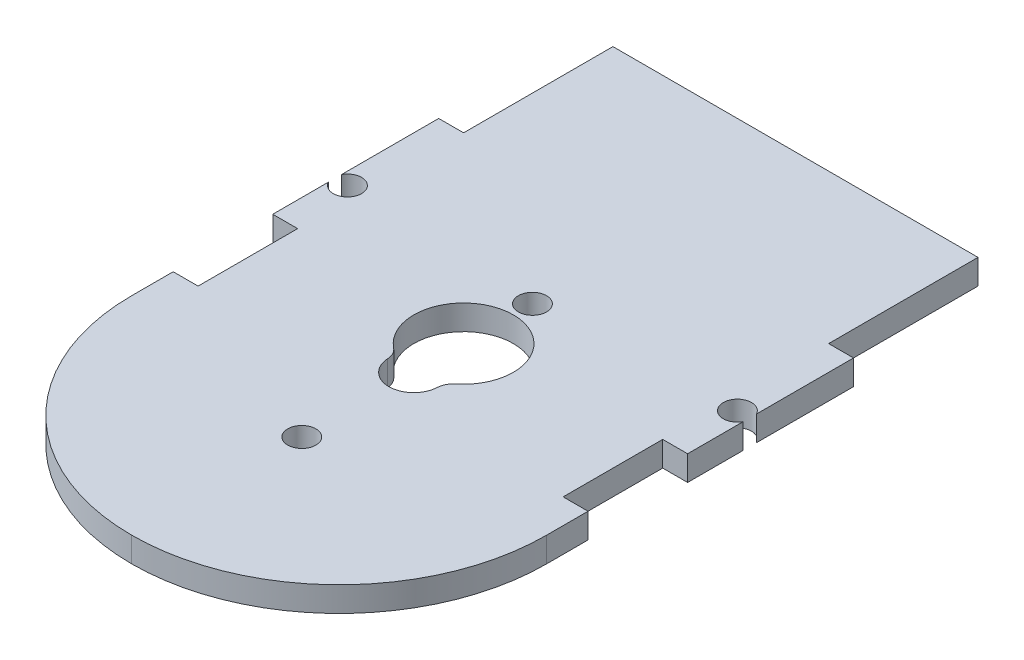
ISO-10303-21;
HEADER;
FILE_DESCRIPTION(('STEP AP214'),'2;1');
FILE_NAME('part.step','',(''),(''),'','','');
FILE_SCHEMA(('AUTOMOTIVE_DESIGN { 1 0 10303 214 1 1 1 1 }'));
ENDSEC;
DATA;
#1=APPLICATION_CONTEXT('core data for automotive mechanical design processes');
#2=APPLICATION_PROTOCOL_DEFINITION('international standard','automotive_design',2000,#1);
#3=PRODUCT_CONTEXT('',#1,'mechanical');
#4=PRODUCT('Part','Part','',(#3));
#5=PRODUCT_RELATED_PRODUCT_CATEGORY('part','',(#4));
#6=PRODUCT_DEFINITION_FORMATION('','',#4);
#7=PRODUCT_DEFINITION_CONTEXT('part definition',#1,'design');
#8=PRODUCT_DEFINITION('design','',#6,#7);
#9=PRODUCT_DEFINITION_SHAPE('','',#8);
#10=(LENGTH_UNIT() NAMED_UNIT(*) SI_UNIT(.MILLI.,.METRE.));
#11=(NAMED_UNIT(*) PLANE_ANGLE_UNIT() SI_UNIT($,.RADIAN.));
#12=(NAMED_UNIT(*) SI_UNIT($,.STERADIAN.) SOLID_ANGLE_UNIT());
#13=UNCERTAINTY_MEASURE_WITH_UNIT(LENGTH_MEASURE(1.E-05),#10,'distance_accuracy_value','');
#14=(GEOMETRIC_REPRESENTATION_CONTEXT(3) GLOBAL_UNCERTAINTY_ASSIGNED_CONTEXT((#13)) GLOBAL_UNIT_ASSIGNED_CONTEXT((#10,
#11,#12)) REPRESENTATION_CONTEXT('',''));
#15=CARTESIAN_POINT('',(0.,0.,0.));
#16=DIRECTION('',(0.,0.,1.));
#17=DIRECTION('',(1.,0.,0.));
#18=AXIS2_PLACEMENT_3D('',#15,#16,#17);
#19=CARTESIAN_POINT('',(0.,3.,0.));
#20=DIRECTION('',(1.,0.,0.));
#21=DIRECTION('',(0.,0.,-1.));
#22=AXIS2_PLACEMENT_3D('',#19,#20,#21);
#23=PLANE('',#22);
#24=DIRECTION('',(0.,0.,1.));
#25=VECTOR('',#24,1.);
#26=CARTESIAN_POINT('',(0.,0.,0.));
#27=LINE('',#26,#25);
#28=CARTESIAN_POINT('',(0.,0.,-62.));
#29=VERTEX_POINT('',#28);
#30=CARTESIAN_POINT('',(0.,0.,-50.3));
#31=VERTEX_POINT('',#30);
#32=EDGE_CURVE('E213',#29,#31,#27,.T.);
#33=ORIENTED_EDGE('',*,*,#32,.T.);
#34=DIRECTION('',(0.,1.,0.));
#35=VECTOR('',#34,1.);
#36=CARTESIAN_POINT('',(0.,3.,-50.3));
#37=LINE('',#36,#35);
#38=CARTESIAN_POINT('',(0.,3.,-50.3));
#39=VERTEX_POINT('',#38);
#40=EDGE_CURVE('E197',#31,#39,#37,.T.);
#41=ORIENTED_EDGE('',*,*,#40,.T.);
#42=DIRECTION('',(0.,0.,1.));
#43=VECTOR('',#42,1.);
#44=CARTESIAN_POINT('',(0.,3.,0.));
#45=LINE('',#44,#43);
#46=CARTESIAN_POINT('',(0.,3.,-62.));
#47=VERTEX_POINT('',#46);
#48=EDGE_CURVE('E248',#47,#39,#45,.T.);
#49=ORIENTED_EDGE('',*,*,#48,.F.);
#50=DIRECTION('',(0.,1.,0.));
#51=VECTOR('',#50,1.);
#52=CARTESIAN_POINT('',(0.,0.,-62.));
#53=LINE('',#52,#51);
#54=EDGE_CURVE('E218',#29,#47,#53,.T.);
#55=ORIENTED_EDGE('',*,*,#54,.F.);
#56=EDGE_LOOP('',(#33,#41,#49,#55));
#57=FACE_BOUND('',#56,.T.);
#58=ADVANCED_FACE('F33',(#57),#23,.F.);
#59=CARTESIAN_POINT('',(50.,3.,0.));
#60=DIRECTION('',(-1.,0.,0.));
#61=DIRECTION('',(0.,0.,1.));
#62=AXIS2_PLACEMENT_3D('',#59,#60,#61);
#63=PLANE('',#62);
#64=DIRECTION('',(0.,0.,-1.));
#65=VECTOR('',#64,1.);
#66=CARTESIAN_POINT('',(50.,0.,0.));
#67=LINE('',#66,#65);
#68=CARTESIAN_POINT('',(50.,0.,-42.));
#69=VERTEX_POINT('',#68);
#70=CARTESIAN_POINT('',(50.,0.,-48.7));
#71=VERTEX_POINT('',#70);
#72=EDGE_CURVE('E222',#69,#71,#67,.T.);
#73=ORIENTED_EDGE('',*,*,#72,.T.);
#74=DIRECTION('',(0.,1.,0.));
#75=VECTOR('',#74,1.);
#76=CARTESIAN_POINT('',(50.,3.,-48.7));
#77=LINE('',#76,#75);
#78=CARTESIAN_POINT('',(50.,3.,-48.7));
#79=VERTEX_POINT('',#78);
#80=EDGE_CURVE('E55',#71,#79,#77,.T.);
#81=ORIENTED_EDGE('',*,*,#80,.T.);
#82=DIRECTION('',(0.,0.,-1.));
#83=VECTOR('',#82,1.);
#84=CARTESIAN_POINT('',(50.,3.,0.));
#85=LINE('',#84,#83);
#86=CARTESIAN_POINT('',(50.,3.,-42.));
#87=VERTEX_POINT('',#86);
#88=EDGE_CURVE('E252',#87,#79,#85,.T.);
#89=ORIENTED_EDGE('',*,*,#88,.F.);
#90=DIRECTION('',(0.,1.,0.));
#91=VECTOR('',#90,1.);
#92=CARTESIAN_POINT('',(50.,0.,-42.));
#93=LINE('',#92,#91);
#94=EDGE_CURVE('E398',#69,#87,#93,.T.);
#95=ORIENTED_EDGE('',*,*,#94,.F.);
#96=EDGE_LOOP('',(#73,#81,#89,#95));
#97=FACE_BOUND('',#96,.T.);
#98=ADVANCED_FACE('F341',(#97),#63,.F.);
#99=CARTESIAN_POINT('',(0.,0.,0.));
#100=DIRECTION('',(0.,-1.,0.));
#101=DIRECTION('',(0.,0.,-1.));
#102=AXIS2_PLACEMENT_3D('',#99,#100,#101);
#103=PLANE('',#102);
#104=CARTESIAN_POINT('',(1.5,0.,-49.5));
#105=DIRECTION('',(0.,1.,0.));
#106=DIRECTION('',(0.,0.,1.));
#107=AXIS2_PLACEMENT_3D('',#104,#105,#106);
#108=CIRCLE('',#107,1.7);
#109=CARTESIAN_POINT('',(0.,0.,-48.7));
#110=VERTEX_POINT('',#109);
#111=EDGE_CURVE('E200',#110,#31,#108,.T.);
#112=ORIENTED_EDGE('',*,*,#111,.T.);
#113=ORIENTED_EDGE('',*,*,#32,.F.);
#114=DIRECTION('',(1.,0.,0.));
#115=VECTOR('',#114,1.);
#116=CARTESIAN_POINT('',(0.,0.,-62.));
#117=LINE('',#116,#115);
#118=CARTESIAN_POINT('',(3.,0.,-62.));
#119=VERTEX_POINT('',#118);
#120=EDGE_CURVE('E469',#29,#119,#117,.T.);
#121=ORIENTED_EDGE('',*,*,#120,.T.);
#122=DIRECTION('',(0.,0.,-1.));
#123=VECTOR('',#122,1.);
#124=CARTESIAN_POINT('',(3.,0.,-80.));
#125=LINE('',#124,#123);
#126=CARTESIAN_POINT('',(3.,0.,-80.));
#127=VERTEX_POINT('',#126);
#128=EDGE_CURVE('E421',#119,#127,#125,.T.);
#129=ORIENTED_EDGE('',*,*,#128,.T.);
#130=DIRECTION('',(-1.,0.,0.));
#131=VECTOR('',#130,1.);
#132=CARTESIAN_POINT('',(0.,0.,-80.));
#133=LINE('',#132,#131);
#134=CARTESIAN_POINT('',(47.,0.,-80.));
#135=VERTEX_POINT('',#134);
#136=EDGE_CURVE('E247',#135,#127,#133,.T.);
#137=ORIENTED_EDGE('',*,*,#136,.F.);
#138=DIRECTION('',(0.,0.,1.));
#139=VECTOR('',#138,1.);
#140=CARTESIAN_POINT('',(47.,0.,-80.));
#141=LINE('',#140,#139);
#142=CARTESIAN_POINT('',(47.,0.,-62.));
#143=VERTEX_POINT('',#142);
#144=EDGE_CURVE('E401',#135,#143,#141,.T.);
#145=ORIENTED_EDGE('',*,*,#144,.T.);
#146=DIRECTION('',(1.,0.,0.));
#147=VECTOR('',#146,1.);
#148=CARTESIAN_POINT('',(50.,0.,-62.));
#149=LINE('',#148,#147);
#150=CARTESIAN_POINT('',(50.,0.,-62.));
#151=VERTEX_POINT('',#150);
#152=EDGE_CURVE('E312',#143,#151,#149,.T.);
#153=ORIENTED_EDGE('',*,*,#152,.T.);
#154=CARTESIAN_POINT('',(50.,0.,-50.3));
#155=VERTEX_POINT('',#154);
#156=EDGE_CURVE('E219',#155,#151,#67,.T.);
#157=ORIENTED_EDGE('',*,*,#156,.F.);
#158=CARTESIAN_POINT('',(48.5,0.,-49.5));
#159=DIRECTION('',(0.,1.,0.));
#160=DIRECTION('',(0.,0.,1.));
#161=AXIS2_PLACEMENT_3D('',#158,#159,#160);
#162=CIRCLE('',#161,1.7);
#163=EDGE_CURVE('E41',#155,#71,#162,.T.);
#164=ORIENTED_EDGE('',*,*,#163,.T.);
#165=ORIENTED_EDGE('',*,*,#72,.F.);
#166=DIRECTION('',(-1.,0.,0.));
#167=VECTOR('',#166,1.);
#168=CARTESIAN_POINT('',(50.,0.,-42.));
#169=LINE('',#168,#167);
#170=CARTESIAN_POINT('',(47.,0.,-42.));
#171=VERTEX_POINT('',#170);
#172=EDGE_CURVE('E422',#69,#171,#169,.T.);
#173=ORIENTED_EDGE('',*,*,#172,.T.);
#174=DIRECTION('',(0.,0.,1.));
#175=VECTOR('',#174,1.);
#176=CARTESIAN_POINT('',(47.,0.,-42.));
#177=LINE('',#176,#175);
#178=CARTESIAN_POINT('',(47.,0.,-30.));
#179=VERTEX_POINT('',#178);
#180=EDGE_CURVE('E425',#171,#179,#177,.T.);
#181=ORIENTED_EDGE('',*,*,#180,.T.);
#182=DIRECTION('',(1.,0.,0.));
#183=VECTOR('',#182,1.);
#184=CARTESIAN_POINT('',(50.,0.,-30.));
#185=LINE('',#184,#183);
#186=CARTESIAN_POINT('',(50.,0.,-30.));
#187=VERTEX_POINT('',#186);
#188=EDGE_CURVE('E400',#179,#187,#185,.T.);
#189=ORIENTED_EDGE('',*,*,#188,.T.);
#190=CARTESIAN_POINT('',(50.,0.,-25.));
#191=VERTEX_POINT('',#190);
#192=EDGE_CURVE('E224',#191,#187,#67,.T.);
#193=ORIENTED_EDGE('',*,*,#192,.F.);
#194=CARTESIAN_POINT('',(25.,0.,-25.));
#195=DIRECTION('',(0.,-1.,0.));
#196=DIRECTION('',(0.,0.,-1.));
#197=AXIS2_PLACEMENT_3D('',#194,#195,#196);
#198=CIRCLE('',#197,25.);
#199=CARTESIAN_POINT('',(25.,0.,0.));
#200=VERTEX_POINT('',#199);
#201=EDGE_CURVE('E281',#191,#200,#198,.T.);
#202=ORIENTED_EDGE('',*,*,#201,.T.);
#203=CARTESIAN_POINT('',(25.,0.,-25.));
#204=DIRECTION('',(0.,-1.,0.));
#205=DIRECTION('',(0.,0.,-1.));
#206=AXIS2_PLACEMENT_3D('',#203,#204,#205);
#207=CIRCLE('',#206,25.);
#208=CARTESIAN_POINT('',(0.,0.,-25.));
#209=VERTEX_POINT('',#208);
#210=EDGE_CURVE('E283',#200,#209,#207,.T.);
#211=ORIENTED_EDGE('',*,*,#210,.T.);
#212=CARTESIAN_POINT('',(0.,0.,-30.));
#213=VERTEX_POINT('',#212);
#214=EDGE_CURVE('E221',#213,#209,#27,.T.);
#215=ORIENTED_EDGE('',*,*,#214,.F.);
#216=DIRECTION('',(1.,0.,0.));
#217=VECTOR('',#216,1.);
#218=CARTESIAN_POINT('',(0.,0.,-30.));
#219=LINE('',#218,#217);
#220=CARTESIAN_POINT('',(3.,0.,-30.));
#221=VERTEX_POINT('',#220);
#222=EDGE_CURVE('E458',#213,#221,#219,.T.);
#223=ORIENTED_EDGE('',*,*,#222,.T.);
#224=DIRECTION('',(0.,0.,-1.));
#225=VECTOR('',#224,1.);
#226=CARTESIAN_POINT('',(3.,0.,-42.));
#227=LINE('',#226,#225);
#228=CARTESIAN_POINT('',(3.,0.,-42.));
#229=VERTEX_POINT('',#228);
#230=EDGE_CURVE('E497',#221,#229,#227,.T.);
#231=ORIENTED_EDGE('',*,*,#230,.T.);
#232=DIRECTION('',(-1.,0.,0.));
#233=VECTOR('',#232,1.);
#234=CARTESIAN_POINT('',(0.,0.,-42.));
#235=LINE('',#234,#233);
#236=CARTESIAN_POINT('',(0.,0.,-42.));
#237=VERTEX_POINT('',#236);
#238=EDGE_CURVE('E468',#229,#237,#235,.T.);
#239=ORIENTED_EDGE('',*,*,#238,.T.);
#240=EDGE_CURVE('E215',#110,#237,#27,.T.);
#241=ORIENTED_EDGE('',*,*,#240,.F.);
#242=EDGE_LOOP('',(#112,#113,#121,#129,#137,#145,#153,#157,#164,#165,#173,#181,#189,#193,#202,
#211,#215,#223,#231,#239,#241));
#243=FACE_BOUND('',#242,.T.);
#244=CARTESIAN_POINT('',(25.,0.,-48.3));
#245=DIRECTION('',(0.,1.,0.));
#246=DIRECTION('',(0.,0.,1.));
#247=AXIS2_PLACEMENT_3D('',#244,#245,#246);
#248=CIRCLE('',#247,1.7);
#249=CARTESIAN_POINT('',(25.,0.,-46.6));
#250=VERTEX_POINT('',#249);
#251=EDGE_CURVE('E487',#250,#250,#248,.T.);
#252=ORIENTED_EDGE('',*,*,#251,.T.);
#253=EDGE_LOOP('',(#252));
#254=FACE_BOUND('',#253,.T.);
#255=CARTESIAN_POINT('',(25.,0.,-20.5));
#256=DIRECTION('',(0.,1.,0.));
#257=DIRECTION('',(0.,0.,1.));
#258=AXIS2_PLACEMENT_3D('',#255,#256,#257);
#259=CIRCLE('',#258,1.7);
#260=CARTESIAN_POINT('',(25.,0.,-18.8));
#261=VERTEX_POINT('',#260);
#262=EDGE_CURVE('E493',#261,#261,#259,.T.);
#263=ORIENTED_EDGE('',*,*,#262,.T.);
#264=EDGE_LOOP('',(#263));
#265=FACE_BOUND('',#264,.T.);
#266=CARTESIAN_POINT('',(25.,0.,-34.));
#267=DIRECTION('',(0.,1.,0.));
#268=DIRECTION('',(0.,0.,1.));
#269=AXIS2_PLACEMENT_3D('',#266,#267,#268);
#270=CIRCLE('',#269,3.);
#271=CARTESIAN_POINT('',(22.0037523466843,0.,-33.85));
#272=VERTEX_POINT('',#271);
#273=CARTESIAN_POINT('',(27.9962476533157,0.,-33.85));
#274=VERTEX_POINT('',#273);
#275=EDGE_CURVE('E238',#272,#274,#270,.T.);
#276=ORIENTED_EDGE('',*,*,#275,.T.);
#277=CARTESIAN_POINT('',(29.9937460888596,0.,-33.75));
#278=DIRECTION('',(0.,-1.,0.));
#279=DIRECTION('',(0.,0.,-1.));
#280=AXIS2_PLACEMENT_3D('',#277,#278,#279);
#281=CIRCLE('',#280,2.);
#282=CARTESIAN_POINT('',(28.7453095666447,0.,-35.3125));
#283=VERTEX_POINT('',#282);
#284=EDGE_CURVE('E279',#274,#283,#281,.T.);
#285=ORIENTED_EDGE('',*,*,#284,.T.);
#286=CARTESIAN_POINT('',(25.,0.,-40.));
#287=DIRECTION('',(0.,1.,0.));
#288=DIRECTION('',(0.,0.,1.));
#289=AXIS2_PLACEMENT_3D('',#286,#287,#288);
#290=CIRCLE('',#289,6.00000000000001);
#291=CARTESIAN_POINT('',(21.2546904333553,0.,-35.3125));
#292=VERTEX_POINT('',#291);
#293=EDGE_CURVE('E226',#283,#292,#290,.T.);
#294=ORIENTED_EDGE('',*,*,#293,.T.);
#295=CARTESIAN_POINT('',(20.0062539111405,0.,-33.75));
#296=DIRECTION('',(0.,-1.,0.));
#297=DIRECTION('',(0.,0.,-1.));
#298=AXIS2_PLACEMENT_3D('',#295,#296,#297);
#299=CIRCLE('',#298,2.);
#300=EDGE_CURVE('E277',#292,#272,#299,.T.);
#301=ORIENTED_EDGE('',*,*,#300,.T.);
#302=EDGE_LOOP('',(#276,#285,#294,#301));
#303=FACE_BOUND('',#302,.T.);
#304=ADVANCED_FACE('F210',(#243,#254,#265,#303),#103,.T.);
#305=CARTESIAN_POINT('',(0.,3.,-48.7));
#306=VERTEX_POINT('',#305);
#307=CARTESIAN_POINT('',(0.,3.,-42.));
#308=VERTEX_POINT('',#307);
#309=EDGE_CURVE('E246',#306,#308,#45,.T.);
#310=ORIENTED_EDGE('',*,*,#309,.F.);
#311=DIRECTION('',(0.,1.,0.));
#312=VECTOR('',#311,1.);
#313=CARTESIAN_POINT('',(0.,3.,-48.7));
#314=LINE('',#313,#312);
#315=EDGE_CURVE('E48',#306,#110,#314,.F.);
#316=ORIENTED_EDGE('',*,*,#315,.T.);
#317=ORIENTED_EDGE('',*,*,#240,.T.);
#318=DIRECTION('',(0.,1.,0.));
#319=VECTOR('',#318,1.);
#320=CARTESIAN_POINT('',(0.,0.,-42.));
#321=LINE('',#320,#319);
#322=EDGE_CURVE('E432',#237,#308,#321,.T.);
#323=ORIENTED_EDGE('',*,*,#322,.T.);
#324=EDGE_LOOP('',(#310,#316,#317,#323));
#325=FACE_BOUND('',#324,.T.);
#326=ADVANCED_FACE('F343',(#325),#23,.F.);
#327=ORIENTED_EDGE('',*,*,#192,.T.);
#328=DIRECTION('',(0.,1.,0.));
#329=VECTOR('',#328,1.);
#330=CARTESIAN_POINT('',(50.,0.,-30.));
#331=LINE('',#330,#329);
#332=CARTESIAN_POINT('',(50.,3.,-30.));
#333=VERTEX_POINT('',#332);
#334=EDGE_CURVE('E382',#187,#333,#331,.T.);
#335=ORIENTED_EDGE('',*,*,#334,.T.);
#336=CARTESIAN_POINT('',(50.,3.,-25.));
#337=VERTEX_POINT('',#336);
#338=EDGE_CURVE('E249',#337,#333,#85,.T.);
#339=ORIENTED_EDGE('',*,*,#338,.F.);
#340=DIRECTION('',(0.,-1.,0.));
#341=VECTOR('',#340,1.);
#342=CARTESIAN_POINT('',(50.,3.,-25.));
#343=LINE('',#342,#341);
#344=EDGE_CURVE('E291',#337,#191,#343,.T.);
#345=ORIENTED_EDGE('',*,*,#344,.T.);
#346=EDGE_LOOP('',(#327,#335,#339,#345));
#347=FACE_BOUND('',#346,.T.);
#348=ADVANCED_FACE('F351',(#347),#63,.F.);
#349=CARTESIAN_POINT('',(0.,3.,-30.));
#350=VERTEX_POINT('',#349);
#351=CARTESIAN_POINT('',(0.,3.,-25.));
#352=VERTEX_POINT('',#351);
#353=EDGE_CURVE('E244',#350,#352,#45,.T.);
#354=ORIENTED_EDGE('',*,*,#353,.F.);
#355=DIRECTION('',(0.,1.,0.));
#356=VECTOR('',#355,1.);
#357=CARTESIAN_POINT('',(0.,0.,-30.));
#358=LINE('',#357,#356);
#359=EDGE_CURVE('E364',#213,#350,#358,.T.);
#360=ORIENTED_EDGE('',*,*,#359,.F.);
#361=ORIENTED_EDGE('',*,*,#214,.T.);
#362=DIRECTION('',(0.,-1.,0.));
#363=VECTOR('',#362,1.);
#364=CARTESIAN_POINT('',(0.,3.,-25.));
#365=LINE('',#364,#363);
#366=EDGE_CURVE('E285',#209,#352,#365,.F.);
#367=ORIENTED_EDGE('',*,*,#366,.T.);
#368=EDGE_LOOP('',(#354,#360,#361,#367));
#369=FACE_BOUND('',#368,.T.);
#370=ADVANCED_FACE('F344',(#369),#23,.F.);
#371=CARTESIAN_POINT('',(50.,3.,-50.3));
#372=VERTEX_POINT('',#371);
#373=CARTESIAN_POINT('',(50.,3.,-62.));
#374=VERTEX_POINT('',#373);
#375=EDGE_CURVE('E253',#372,#374,#85,.T.);
#376=ORIENTED_EDGE('',*,*,#375,.F.);
#377=DIRECTION('',(0.,1.,0.));
#378=VECTOR('',#377,1.);
#379=CARTESIAN_POINT('',(50.,3.,-50.3));
#380=LINE('',#379,#378);
#381=EDGE_CURVE('E481',#372,#155,#380,.F.);
#382=ORIENTED_EDGE('',*,*,#381,.T.);
#383=ORIENTED_EDGE('',*,*,#156,.T.);
#384=DIRECTION('',(0.,1.,0.));
#385=VECTOR('',#384,1.);
#386=CARTESIAN_POINT('',(50.,0.,-62.));
#387=LINE('',#386,#385);
#388=EDGE_CURVE('E294',#151,#374,#387,.T.);
#389=ORIENTED_EDGE('',*,*,#388,.T.);
#390=EDGE_LOOP('',(#376,#382,#383,#389));
#391=FACE_BOUND('',#390,.T.);
#392=ADVANCED_FACE('F352',(#391),#63,.F.);
#393=CARTESIAN_POINT('',(0.,3.,-80.));
#394=DIRECTION('',(0.,0.,1.));
#395=DIRECTION('',(1.,0.,0.));
#396=AXIS2_PLACEMENT_3D('',#393,#394,#395);
#397=PLANE('',#396);
#398=ORIENTED_EDGE('',*,*,#136,.T.);
#399=DIRECTION('',(0.,1.,0.));
#400=VECTOR('',#399,1.);
#401=CARTESIAN_POINT('',(3.,0.,-80.));
#402=LINE('',#401,#400);
#403=CARTESIAN_POINT('',(3.,3.,-80.));
#404=VERTEX_POINT('',#403);
#405=EDGE_CURVE('E407',#127,#404,#402,.T.);
#406=ORIENTED_EDGE('',*,*,#405,.T.);
#407=DIRECTION('',(-1.,0.,0.));
#408=VECTOR('',#407,1.);
#409=CARTESIAN_POINT('',(0.,3.,-80.));
#410=LINE('',#409,#408);
#411=CARTESIAN_POINT('',(47.,3.,-80.));
#412=VERTEX_POINT('',#411);
#413=EDGE_CURVE('E251',#412,#404,#410,.T.);
#414=ORIENTED_EDGE('',*,*,#413,.F.);
#415=DIRECTION('',(0.,1.,0.));
#416=VECTOR('',#415,1.);
#417=CARTESIAN_POINT('',(47.,0.,-80.));
#418=LINE('',#417,#416);
#419=EDGE_CURVE('E306',#135,#412,#418,.T.);
#420=ORIENTED_EDGE('',*,*,#419,.F.);
#421=EDGE_LOOP('',(#398,#406,#414,#420));
#422=FACE_BOUND('',#421,.T.);
#423=ADVANCED_FACE('F361',(#422),#397,.F.);
#424=CARTESIAN_POINT('',(0.,3.,0.));
#425=DIRECTION('',(0.,-1.,0.));
#426=DIRECTION('',(0.,0.,-1.));
#427=AXIS2_PLACEMENT_3D('',#424,#425,#426);
#428=PLANE('',#427);
#429=CARTESIAN_POINT('',(25.,3.,-48.3));
#430=DIRECTION('',(0.,1.,0.));
#431=DIRECTION('',(0.,0.,1.));
#432=AXIS2_PLACEMENT_3D('',#429,#430,#431);
#433=CIRCLE('',#432,1.7);
#434=CARTESIAN_POINT('',(25.,3.,-46.6));
#435=VERTEX_POINT('',#434);
#436=EDGE_CURVE('E484',#435,#435,#433,.T.);
#437=ORIENTED_EDGE('',*,*,#436,.F.);
#438=EDGE_LOOP('',(#437));
#439=FACE_BOUND('',#438,.T.);
#440=CARTESIAN_POINT('',(25.,3.,-20.5));
#441=DIRECTION('',(0.,1.,0.));
#442=DIRECTION('',(0.,0.,1.));
#443=AXIS2_PLACEMENT_3D('',#440,#441,#442);
#444=CIRCLE('',#443,1.7);
#445=CARTESIAN_POINT('',(25.,3.,-18.8));
#446=VERTEX_POINT('',#445);
#447=EDGE_CURVE('E490',#446,#446,#444,.T.);
#448=ORIENTED_EDGE('',*,*,#447,.F.);
#449=EDGE_LOOP('',(#448));
#450=FACE_BOUND('',#449,.T.);
#451=CARTESIAN_POINT('',(25.,3.,-40.));
#452=DIRECTION('',(0.,1.,0.));
#453=DIRECTION('',(0.,0.,1.));
#454=AXIS2_PLACEMENT_3D('',#451,#452,#453);
#455=CIRCLE('',#454,6.00000000000001);
#456=CARTESIAN_POINT('',(28.7453095666447,3.,-35.3125));
#457=VERTEX_POINT('',#456);
#458=CARTESIAN_POINT('',(21.2546904333553,3.,-35.3125));
#459=VERTEX_POINT('',#458);
#460=EDGE_CURVE('E233',#457,#459,#455,.T.);
#461=ORIENTED_EDGE('',*,*,#460,.F.);
#462=CARTESIAN_POINT('',(29.9937460888596,3.,-33.75));
#463=DIRECTION('',(0.,-1.,0.));
#464=DIRECTION('',(0.,0.,-1.));
#465=AXIS2_PLACEMENT_3D('',#462,#463,#464);
#466=CIRCLE('',#465,2.);
#467=CARTESIAN_POINT('',(27.9962476533157,3.,-33.85));
#468=VERTEX_POINT('',#467);
#469=EDGE_CURVE('E271',#457,#468,#466,.F.);
#470=ORIENTED_EDGE('',*,*,#469,.T.);
#471=CARTESIAN_POINT('',(25.,3.,-34.));
#472=DIRECTION('',(0.,1.,0.));
#473=DIRECTION('',(0.,0.,1.));
#474=AXIS2_PLACEMENT_3D('',#471,#472,#473);
#475=CIRCLE('',#474,3.);
#476=CARTESIAN_POINT('',(22.0037523466843,3.,-33.85));
#477=VERTEX_POINT('',#476);
#478=EDGE_CURVE('E241',#477,#468,#475,.T.);
#479=ORIENTED_EDGE('',*,*,#478,.F.);
#480=CARTESIAN_POINT('',(20.0062539111405,3.,-33.75));
#481=DIRECTION('',(0.,-1.,0.));
#482=DIRECTION('',(0.,0.,-1.));
#483=AXIS2_PLACEMENT_3D('',#480,#481,#482);
#484=CIRCLE('',#483,2.);
#485=EDGE_CURVE('E266',#477,#459,#484,.F.);
#486=ORIENTED_EDGE('',*,*,#485,.T.);
#487=EDGE_LOOP('',(#461,#470,#479,#486));
#488=FACE_BOUND('',#487,.T.);
#489=ORIENTED_EDGE('',*,*,#48,.T.);
#490=CARTESIAN_POINT('',(1.5,3.,-49.5));
#491=DIRECTION('',(0.,-1.,0.));
#492=DIRECTION('',(0.,0.,-1.));
#493=AXIS2_PLACEMENT_3D('',#490,#491,#492);
#494=CIRCLE('',#493,1.7);
#495=EDGE_CURVE('E11',#39,#306,#494,.T.);
#496=ORIENTED_EDGE('',*,*,#495,.T.);
#497=ORIENTED_EDGE('',*,*,#309,.T.);
#498=DIRECTION('',(-1.,0.,0.));
#499=VECTOR('',#498,1.);
#500=CARTESIAN_POINT('',(0.,3.,-42.));
#501=LINE('',#500,#499);
#502=CARTESIAN_POINT('',(3.,3.,-42.));
#503=VERTEX_POINT('',#502);
#504=EDGE_CURVE('E450',#503,#308,#501,.T.);
#505=ORIENTED_EDGE('',*,*,#504,.F.);
#506=DIRECTION('',(0.,0.,-1.));
#507=VECTOR('',#506,1.);
#508=CARTESIAN_POINT('',(3.,3.,-42.));
#509=LINE('',#508,#507);
#510=CARTESIAN_POINT('',(3.,3.,-30.));
#511=VERTEX_POINT('',#510);
#512=EDGE_CURVE('E459',#511,#503,#509,.T.);
#513=ORIENTED_EDGE('',*,*,#512,.F.);
#514=DIRECTION('',(1.,0.,0.));
#515=VECTOR('',#514,1.);
#516=CARTESIAN_POINT('',(0.,3.,-30.));
#517=LINE('',#516,#515);
#518=EDGE_CURVE('E370',#350,#511,#517,.T.);
#519=ORIENTED_EDGE('',*,*,#518,.F.);
#520=ORIENTED_EDGE('',*,*,#353,.T.);
#521=CARTESIAN_POINT('',(25.,3.,-25.));
#522=DIRECTION('',(0.,-1.,0.));
#523=DIRECTION('',(0.,0.,-1.));
#524=AXIS2_PLACEMENT_3D('',#521,#522,#523);
#525=CIRCLE('',#524,25.);
#526=CARTESIAN_POINT('',(25.,3.,0.));
#527=VERTEX_POINT('',#526);
#528=EDGE_CURVE('E289',#352,#527,#525,.F.);
#529=ORIENTED_EDGE('',*,*,#528,.T.);
#530=CARTESIAN_POINT('',(25.,3.,-25.));
#531=DIRECTION('',(0.,-1.,0.));
#532=DIRECTION('',(0.,0.,-1.));
#533=AXIS2_PLACEMENT_3D('',#530,#531,#532);
#534=CIRCLE('',#533,25.);
#535=EDGE_CURVE('E287',#527,#337,#534,.F.);
#536=ORIENTED_EDGE('',*,*,#535,.T.);
#537=ORIENTED_EDGE('',*,*,#338,.T.);
#538=DIRECTION('',(1.,0.,0.));
#539=VECTOR('',#538,1.);
#540=CARTESIAN_POINT('',(50.,3.,-30.));
#541=LINE('',#540,#539);
#542=CARTESIAN_POINT('',(47.,3.,-30.));
#543=VERTEX_POINT('',#542);
#544=EDGE_CURVE('E394',#543,#333,#541,.T.);
#545=ORIENTED_EDGE('',*,*,#544,.F.);
#546=DIRECTION('',(0.,0.,1.));
#547=VECTOR('',#546,1.);
#548=CARTESIAN_POINT('',(47.,3.,-42.));
#549=LINE('',#548,#547);
#550=CARTESIAN_POINT('',(47.,3.,-42.));
#551=VERTEX_POINT('',#550);
#552=EDGE_CURVE('E431',#551,#543,#549,.T.);
#553=ORIENTED_EDGE('',*,*,#552,.F.);
#554=DIRECTION('',(-1.,0.,0.));
#555=VECTOR('',#554,1.);
#556=CARTESIAN_POINT('',(50.,3.,-42.));
#557=LINE('',#556,#555);
#558=EDGE_CURVE('E429',#87,#551,#557,.T.);
#559=ORIENTED_EDGE('',*,*,#558,.F.);
#560=ORIENTED_EDGE('',*,*,#88,.T.);
#561=CARTESIAN_POINT('',(48.5,3.,-49.5));
#562=DIRECTION('',(0.,1.,0.));
#563=DIRECTION('',(0.,0.,1.));
#564=AXIS2_PLACEMENT_3D('',#561,#562,#563);
#565=CIRCLE('',#564,1.7);
#566=EDGE_CURVE('E205',#372,#79,#565,.T.);
#567=ORIENTED_EDGE('',*,*,#566,.F.);
#568=ORIENTED_EDGE('',*,*,#375,.T.);
#569=DIRECTION('',(1.,0.,0.));
#570=VECTOR('',#569,1.);
#571=CARTESIAN_POINT('',(50.,3.,-62.));
#572=LINE('',#571,#570);
#573=CARTESIAN_POINT('',(47.,3.,-62.));
#574=VERTEX_POINT('',#573);
#575=EDGE_CURVE('E309',#574,#374,#572,.T.);
#576=ORIENTED_EDGE('',*,*,#575,.F.);
#577=DIRECTION('',(0.,0.,1.));
#578=VECTOR('',#577,1.);
#579=CARTESIAN_POINT('',(47.,3.,-80.));
#580=LINE('',#579,#578);
#581=EDGE_CURVE('E405',#412,#574,#580,.T.);
#582=ORIENTED_EDGE('',*,*,#581,.F.);
#583=ORIENTED_EDGE('',*,*,#413,.T.);
#584=DIRECTION('',(0.,0.,-1.));
#585=VECTOR('',#584,1.);
#586=CARTESIAN_POINT('',(3.,3.,-80.));
#587=LINE('',#586,#585);
#588=CARTESIAN_POINT('',(3.,3.,-62.));
#589=VERTEX_POINT('',#588);
#590=EDGE_CURVE('E389',#589,#404,#587,.T.);
#591=ORIENTED_EDGE('',*,*,#590,.F.);
#592=DIRECTION('',(1.,0.,0.));
#593=VECTOR('',#592,1.);
#594=CARTESIAN_POINT('',(0.,3.,-62.));
#595=LINE('',#594,#593);
#596=EDGE_CURVE('E385',#47,#589,#595,.T.);
#597=ORIENTED_EDGE('',*,*,#596,.F.);
#598=EDGE_LOOP('',(#489,#496,#497,#505,#513,#519,#520,#529,#536,#537,#545,#553,#559,#560,#567,
#568,#576,#582,#583,#591,#597));
#599=FACE_BOUND('',#598,.T.);
#600=ADVANCED_FACE('F325',(#439,#450,#488,#599),#428,.F.);
#601=CARTESIAN_POINT('',(25.,0.,-40.));
#602=DIRECTION('',(0.,1.,0.));
#603=DIRECTION('',(0.,0.,1.));
#604=AXIS2_PLACEMENT_3D('',#601,#602,#603);
#605=CYLINDRICAL_SURFACE('',#604,6.00000000000001);
#606=ORIENTED_EDGE('',*,*,#293,.F.);
#607=DIRECTION('',(0.,1.,0.));
#608=VECTOR('',#607,1.);
#609=CARTESIAN_POINT('',(28.7453095666447,0.,-35.3125));
#610=LINE('',#609,#608);
#611=EDGE_CURVE('E261',#283,#457,#610,.T.);
#612=ORIENTED_EDGE('',*,*,#611,.T.);
#613=ORIENTED_EDGE('',*,*,#460,.T.);
#614=DIRECTION('',(0.,1.,0.));
#615=VECTOR('',#614,1.);
#616=CARTESIAN_POINT('',(21.2546904333553,0.,-35.3125));
#617=LINE('',#616,#615);
#618=EDGE_CURVE('E255',#459,#292,#617,.F.);
#619=ORIENTED_EDGE('',*,*,#618,.T.);
#620=EDGE_LOOP('',(#606,#612,#613,#619));
#621=FACE_BOUND('',#620,.T.);
#622=ADVANCED_FACE('F323',(#621),#605,.F.);
#623=CARTESIAN_POINT('',(25.,0.,-34.));
#624=DIRECTION('',(0.,1.,0.));
#625=DIRECTION('',(0.,0.,1.));
#626=AXIS2_PLACEMENT_3D('',#623,#624,#625);
#627=CYLINDRICAL_SURFACE('',#626,3.);
#628=ORIENTED_EDGE('',*,*,#478,.T.);
#629=DIRECTION('',(0.,1.,0.));
#630=VECTOR('',#629,1.);
#631=CARTESIAN_POINT('',(27.9962476533157,0.,-33.85));
#632=LINE('',#631,#630);
#633=EDGE_CURVE('E275',#468,#274,#632,.F.);
#634=ORIENTED_EDGE('',*,*,#633,.T.);
#635=ORIENTED_EDGE('',*,*,#275,.F.);
#636=DIRECTION('',(0.,1.,0.));
#637=VECTOR('',#636,1.);
#638=CARTESIAN_POINT('',(22.0037523466843,0.,-33.85));
#639=LINE('',#638,#637);
#640=EDGE_CURVE('E273',#272,#477,#639,.T.);
#641=ORIENTED_EDGE('',*,*,#640,.T.);
#642=EDGE_LOOP('',(#628,#634,#635,#641));
#643=FACE_BOUND('',#642,.T.);
#644=ADVANCED_FACE('F330',(#643),#627,.F.);
#645=CARTESIAN_POINT('',(29.9937460888596,0.,-33.75));
#646=DIRECTION('',(0.,1.,0.));
#647=DIRECTION('',(0.,0.,1.));
#648=AXIS2_PLACEMENT_3D('',#645,#646,#647);
#649=CYLINDRICAL_SURFACE('',#648,2.);
#650=ORIENTED_EDGE('',*,*,#284,.F.);
#651=ORIENTED_EDGE('',*,*,#633,.F.);
#652=ORIENTED_EDGE('',*,*,#469,.F.);
#653=ORIENTED_EDGE('',*,*,#611,.F.);
#654=EDGE_LOOP('',(#650,#651,#652,#653));
#655=FACE_BOUND('',#654,.T.);
#656=ADVANCED_FACE('F321',(#655),#649,.T.);
#657=CARTESIAN_POINT('',(20.0062539111405,0.,-33.75));
#658=DIRECTION('',(0.,-1.,0.));
#659=DIRECTION('',(0.,0.,-1.));
#660=AXIS2_PLACEMENT_3D('',#657,#658,#659);
#661=CYLINDRICAL_SURFACE('',#660,2.);
#662=ORIENTED_EDGE('',*,*,#485,.F.);
#663=ORIENTED_EDGE('',*,*,#640,.F.);
#664=ORIENTED_EDGE('',*,*,#300,.F.);
#665=ORIENTED_EDGE('',*,*,#618,.F.);
#666=EDGE_LOOP('',(#662,#663,#664,#665));
#667=FACE_BOUND('',#666,.T.);
#668=ADVANCED_FACE('F329',(#667),#661,.T.);
#669=CARTESIAN_POINT('',(25.,3.,-25.));
#670=DIRECTION('',(0.,-1.,0.));
#671=DIRECTION('',(0.,0.,-1.));
#672=AXIS2_PLACEMENT_3D('',#669,#670,#671);
#673=CYLINDRICAL_SURFACE('',#672,25.);
#674=ORIENTED_EDGE('',*,*,#344,.F.);
#675=ORIENTED_EDGE('',*,*,#535,.F.);
#676=DIRECTION('',(0.,-1.,0.));
#677=VECTOR('',#676,1.);
#678=CARTESIAN_POINT('',(25.,3.,0.));
#679=LINE('',#678,#677);
#680=EDGE_CURVE('E292',#200,#527,#679,.F.);
#681=ORIENTED_EDGE('',*,*,#680,.F.);
#682=ORIENTED_EDGE('',*,*,#201,.F.);
#683=EDGE_LOOP('',(#674,#675,#681,#682));
#684=FACE_BOUND('',#683,.T.);
#685=ADVANCED_FACE('F35',(#684),#673,.T.);
#686=CARTESIAN_POINT('',(25.,3.,-25.));
#687=DIRECTION('',(0.,-1.,0.));
#688=DIRECTION('',(0.,0.,-1.));
#689=AXIS2_PLACEMENT_3D('',#686,#687,#688);
#690=CYLINDRICAL_SURFACE('',#689,25.);
#691=ORIENTED_EDGE('',*,*,#528,.F.);
#692=ORIENTED_EDGE('',*,*,#366,.F.);
#693=ORIENTED_EDGE('',*,*,#210,.F.);
#694=ORIENTED_EDGE('',*,*,#680,.T.);
#695=EDGE_LOOP('',(#691,#692,#693,#694));
#696=FACE_BOUND('',#695,.T.);
#697=ADVANCED_FACE('F371',(#696),#690,.T.);
#698=CARTESIAN_POINT('',(50.,0.,-62.));
#699=DIRECTION('',(0.,0.,1.));
#700=DIRECTION('',(1.,0.,0.));
#701=AXIS2_PLACEMENT_3D('',#698,#699,#700);
#702=PLANE('',#701);
#703=ORIENTED_EDGE('',*,*,#575,.T.);
#704=ORIENTED_EDGE('',*,*,#388,.F.);
#705=ORIENTED_EDGE('',*,*,#152,.F.);
#706=DIRECTION('',(0.,1.,0.));
#707=VECTOR('',#706,1.);
#708=CARTESIAN_POINT('',(47.,0.,-62.));
#709=LINE('',#708,#707);
#710=EDGE_CURVE('E301',#143,#574,#709,.T.);
#711=ORIENTED_EDGE('',*,*,#710,.T.);
#712=EDGE_LOOP('',(#703,#704,#705,#711));
#713=FACE_BOUND('',#712,.T.);
#714=ADVANCED_FACE('F530',(#713),#702,.F.);
#715=CARTESIAN_POINT('',(47.,0.,-80.));
#716=DIRECTION('',(-1.,0.,0.));
#717=DIRECTION('',(0.,0.,1.));
#718=AXIS2_PLACEMENT_3D('',#715,#716,#717);
#719=PLANE('',#718);
#720=ORIENTED_EDGE('',*,*,#581,.T.);
#721=ORIENTED_EDGE('',*,*,#710,.F.);
#722=ORIENTED_EDGE('',*,*,#144,.F.);
#723=ORIENTED_EDGE('',*,*,#419,.T.);
#724=EDGE_LOOP('',(#720,#721,#722,#723));
#725=FACE_BOUND('',#724,.T.);
#726=ADVANCED_FACE('F532',(#725),#719,.F.);
#727=CARTESIAN_POINT('',(0.,0.,-42.));
#728=DIRECTION('',(0.,0.,-1.));
#729=DIRECTION('',(-1.,0.,0.));
#730=AXIS2_PLACEMENT_3D('',#727,#728,#729);
#731=PLANE('',#730);
#732=ORIENTED_EDGE('',*,*,#504,.T.);
#733=ORIENTED_EDGE('',*,*,#322,.F.);
#734=ORIENTED_EDGE('',*,*,#238,.F.);
#735=DIRECTION('',(0.,1.,0.));
#736=VECTOR('',#735,1.);
#737=CARTESIAN_POINT('',(3.,0.,-42.));
#738=LINE('',#737,#736);
#739=EDGE_CURVE('E456',#229,#503,#738,.T.);
#740=ORIENTED_EDGE('',*,*,#739,.T.);
#741=EDGE_LOOP('',(#732,#733,#734,#740));
#742=FACE_BOUND('',#741,.T.);
#743=ADVANCED_FACE('F454',(#742),#731,.F.);
#744=CARTESIAN_POINT('',(3.,0.,-42.));
#745=DIRECTION('',(1.,0.,0.));
#746=DIRECTION('',(0.,0.,-1.));
#747=AXIS2_PLACEMENT_3D('',#744,#745,#746);
#748=PLANE('',#747);
#749=ORIENTED_EDGE('',*,*,#512,.T.);
#750=ORIENTED_EDGE('',*,*,#739,.F.);
#751=ORIENTED_EDGE('',*,*,#230,.F.);
#752=DIRECTION('',(0.,1.,0.));
#753=VECTOR('',#752,1.);
#754=CARTESIAN_POINT('',(3.,0.,-30.));
#755=LINE('',#754,#753);
#756=EDGE_CURVE('E462',#221,#511,#755,.T.);
#757=ORIENTED_EDGE('',*,*,#756,.T.);
#758=EDGE_LOOP('',(#749,#750,#751,#757));
#759=FACE_BOUND('',#758,.T.);
#760=ADVANCED_FACE('F502',(#759),#748,.F.);
#761=CARTESIAN_POINT('',(0.,0.,-30.));
#762=DIRECTION('',(0.,0.,1.));
#763=DIRECTION('',(1.,0.,0.));
#764=AXIS2_PLACEMENT_3D('',#761,#762,#763);
#765=PLANE('',#764);
#766=ORIENTED_EDGE('',*,*,#518,.T.);
#767=ORIENTED_EDGE('',*,*,#756,.F.);
#768=ORIENTED_EDGE('',*,*,#222,.F.);
#769=ORIENTED_EDGE('',*,*,#359,.T.);
#770=EDGE_LOOP('',(#766,#767,#768,#769));
#771=FACE_BOUND('',#770,.T.);
#772=ADVANCED_FACE('F505',(#771),#765,.F.);
#773=CARTESIAN_POINT('',(50.,0.,-30.));
#774=DIRECTION('',(0.,0.,1.));
#775=DIRECTION('',(1.,0.,0.));
#776=AXIS2_PLACEMENT_3D('',#773,#774,#775);
#777=PLANE('',#776);
#778=ORIENTED_EDGE('',*,*,#544,.T.);
#779=ORIENTED_EDGE('',*,*,#334,.F.);
#780=ORIENTED_EDGE('',*,*,#188,.F.);
#781=DIRECTION('',(0.,1.,0.));
#782=VECTOR('',#781,1.);
#783=CARTESIAN_POINT('',(47.,0.,-30.));
#784=LINE('',#783,#782);
#785=EDGE_CURVE('E386',#179,#543,#784,.T.);
#786=ORIENTED_EDGE('',*,*,#785,.T.);
#787=EDGE_LOOP('',(#778,#779,#780,#786));
#788=FACE_BOUND('',#787,.T.);
#789=ADVANCED_FACE('F436',(#788),#777,.F.);
#790=CARTESIAN_POINT('',(47.,0.,-42.));
#791=DIRECTION('',(-1.,0.,0.));
#792=DIRECTION('',(0.,0.,1.));
#793=AXIS2_PLACEMENT_3D('',#790,#791,#792);
#794=PLANE('',#793);
#795=ORIENTED_EDGE('',*,*,#552,.T.);
#796=ORIENTED_EDGE('',*,*,#785,.F.);
#797=ORIENTED_EDGE('',*,*,#180,.F.);
#798=DIRECTION('',(0.,1.,0.));
#799=VECTOR('',#798,1.);
#800=CARTESIAN_POINT('',(47.,0.,-42.));
#801=LINE('',#800,#799);
#802=EDGE_CURVE('E391',#171,#551,#801,.T.);
#803=ORIENTED_EDGE('',*,*,#802,.T.);
#804=EDGE_LOOP('',(#795,#796,#797,#803));
#805=FACE_BOUND('',#804,.T.);
#806=ADVANCED_FACE('F512',(#805),#794,.F.);
#807=CARTESIAN_POINT('',(50.,0.,-42.));
#808=DIRECTION('',(0.,0.,-1.));
#809=DIRECTION('',(-1.,0.,0.));
#810=AXIS2_PLACEMENT_3D('',#807,#808,#809);
#811=PLANE('',#810);
#812=ORIENTED_EDGE('',*,*,#558,.T.);
#813=ORIENTED_EDGE('',*,*,#802,.F.);
#814=ORIENTED_EDGE('',*,*,#172,.F.);
#815=ORIENTED_EDGE('',*,*,#94,.T.);
#816=EDGE_LOOP('',(#812,#813,#814,#815));
#817=FACE_BOUND('',#816,.T.);
#818=ADVANCED_FACE('F521',(#817),#811,.F.);
#819=CARTESIAN_POINT('',(3.,0.,-80.));
#820=DIRECTION('',(1.,0.,0.));
#821=DIRECTION('',(0.,0.,-1.));
#822=AXIS2_PLACEMENT_3D('',#819,#820,#821);
#823=PLANE('',#822);
#824=ORIENTED_EDGE('',*,*,#590,.T.);
#825=ORIENTED_EDGE('',*,*,#405,.F.);
#826=ORIENTED_EDGE('',*,*,#128,.F.);
#827=DIRECTION('',(0.,1.,0.));
#828=VECTOR('',#827,1.);
#829=CARTESIAN_POINT('',(3.,0.,-62.));
#830=LINE('',#829,#828);
#831=EDGE_CURVE('E413',#119,#589,#830,.T.);
#832=ORIENTED_EDGE('',*,*,#831,.T.);
#833=EDGE_LOOP('',(#824,#825,#826,#832));
#834=FACE_BOUND('',#833,.T.);
#835=ADVANCED_FACE('F517',(#834),#823,.F.);
#836=CARTESIAN_POINT('',(0.,0.,-62.));
#837=DIRECTION('',(0.,0.,1.));
#838=DIRECTION('',(1.,0.,0.));
#839=AXIS2_PLACEMENT_3D('',#836,#837,#838);
#840=PLANE('',#839);
#841=ORIENTED_EDGE('',*,*,#596,.T.);
#842=ORIENTED_EDGE('',*,*,#831,.F.);
#843=ORIENTED_EDGE('',*,*,#120,.F.);
#844=ORIENTED_EDGE('',*,*,#54,.T.);
#845=EDGE_LOOP('',(#841,#842,#843,#844));
#846=FACE_BOUND('',#845,.T.);
#847=ADVANCED_FACE('F520',(#846),#840,.F.);
#848=CARTESIAN_POINT('',(25.,3.,-20.5));
#849=DIRECTION('',(0.,1.,0.));
#850=DIRECTION('',(0.,0.,1.));
#851=AXIS2_PLACEMENT_3D('',#848,#849,#850);
#852=CYLINDRICAL_SURFACE('',#851,1.7);
#853=ORIENTED_EDGE('',*,*,#262,.F.);
#854=EDGE_LOOP('',(#853));
#855=FACE_BOUND('',#854,.T.);
#856=ORIENTED_EDGE('',*,*,#447,.T.);
#857=EDGE_LOOP('',(#856));
#858=FACE_BOUND('',#857,.T.);
#859=ADVANCED_FACE('F523',(#855,#858),#852,.F.);
#860=CARTESIAN_POINT('',(25.,3.,-48.3));
#861=DIRECTION('',(0.,1.,0.));
#862=DIRECTION('',(0.,0.,1.));
#863=AXIS2_PLACEMENT_3D('',#860,#861,#862);
#864=CYLINDRICAL_SURFACE('',#863,1.7);
#865=ORIENTED_EDGE('',*,*,#251,.F.);
#866=EDGE_LOOP('',(#865));
#867=FACE_BOUND('',#866,.T.);
#868=ORIENTED_EDGE('',*,*,#436,.T.);
#869=EDGE_LOOP('',(#868));
#870=FACE_BOUND('',#869,.T.);
#871=ADVANCED_FACE('F543',(#867,#870),#864,.F.);
#872=CARTESIAN_POINT('',(48.5,3.,-49.5));
#873=DIRECTION('',(0.,1.,0.));
#874=DIRECTION('',(0.,0.,1.));
#875=AXIS2_PLACEMENT_3D('',#872,#873,#874);
#876=CYLINDRICAL_SURFACE('',#875,1.7);
#877=ORIENTED_EDGE('',*,*,#163,.F.);
#878=ORIENTED_EDGE('',*,*,#381,.F.);
#879=ORIENTED_EDGE('',*,*,#566,.T.);
#880=ORIENTED_EDGE('',*,*,#80,.F.);
#881=EDGE_LOOP('',(#877,#878,#879,#880));
#882=FACE_BOUND('',#881,.T.);
#883=ADVANCED_FACE('F547',(#882),#876,.F.);
#884=CARTESIAN_POINT('',(1.5,3.,-49.5));
#885=DIRECTION('',(0.,1.,0.));
#886=DIRECTION('',(0.,0.,1.));
#887=AXIS2_PLACEMENT_3D('',#884,#885,#886);
#888=CYLINDRICAL_SURFACE('',#887,1.7);
#889=ORIENTED_EDGE('',*,*,#111,.F.);
#890=ORIENTED_EDGE('',*,*,#315,.F.);
#891=ORIENTED_EDGE('',*,*,#495,.F.);
#892=ORIENTED_EDGE('',*,*,#40,.F.);
#893=EDGE_LOOP('',(#889,#890,#891,#892));
#894=FACE_BOUND('',#893,.T.);
#895=ADVANCED_FACE('F199',(#894),#888,.F.);
#896=CLOSED_SHELL('',(#58,#98,#304,#326,#348,#370,#392,#423,#600,#622,#644,#656,#668,#685,#697,
#714,#726,#743,#760,#772,#789,#806,#818,#835,#847,#859,#871,#883,#895));
#897=MANIFOLD_SOLID_BREP('B2',#896);
#898=ADVANCED_BREP_SHAPE_REPRESENTATION('',(#18,#897),#14);
#899=SHAPE_DEFINITION_REPRESENTATION(#9,#898);
ENDSEC;
END-ISO-10303-21;
